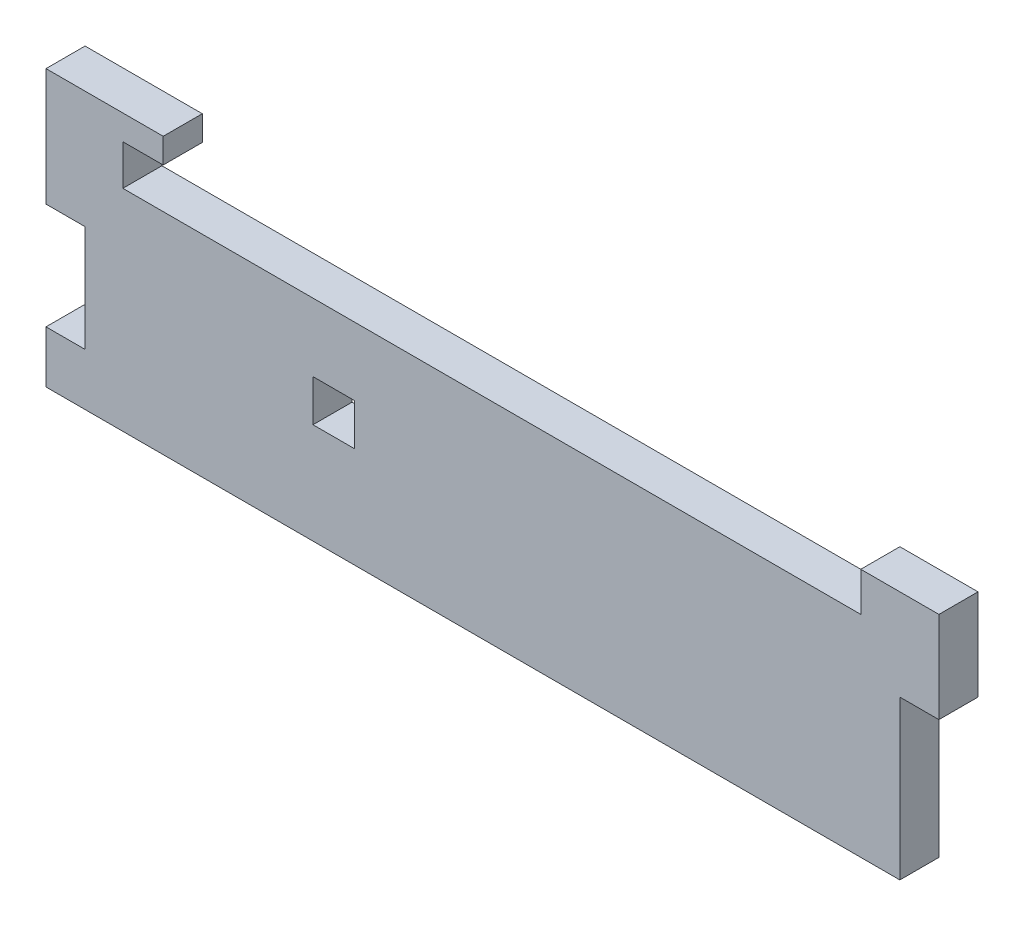
ISO-10303-21;
HEADER;
FILE_DESCRIPTION(('STEP AP214'),'2;1');
FILE_NAME('part.step','',(''),(''),'','','');
FILE_SCHEMA(('AUTOMOTIVE_DESIGN { 1 0 10303 214 1 1 1 1 }'));
ENDSEC;
DATA;
#1=APPLICATION_CONTEXT('core data for automotive mechanical design processes');
#2=APPLICATION_PROTOCOL_DEFINITION('international standard','automotive_design',2000,#1);
#3=PRODUCT_CONTEXT('',#1,'mechanical');
#4=PRODUCT('Part','Part','',(#3));
#5=PRODUCT_RELATED_PRODUCT_CATEGORY('part','',(#4));
#6=PRODUCT_DEFINITION_FORMATION('','',#4);
#7=PRODUCT_DEFINITION_CONTEXT('part definition',#1,'design');
#8=PRODUCT_DEFINITION('design','',#6,#7);
#9=PRODUCT_DEFINITION_SHAPE('','',#8);
#10=(LENGTH_UNIT() NAMED_UNIT(*) SI_UNIT(.MILLI.,.METRE.));
#11=(NAMED_UNIT(*) PLANE_ANGLE_UNIT() SI_UNIT($,.RADIAN.));
#12=(NAMED_UNIT(*) SI_UNIT($,.STERADIAN.) SOLID_ANGLE_UNIT());
#13=UNCERTAINTY_MEASURE_WITH_UNIT(LENGTH_MEASURE(1.E-05),#10,'distance_accuracy_value','');
#14=(GEOMETRIC_REPRESENTATION_CONTEXT(3) GLOBAL_UNCERTAINTY_ASSIGNED_CONTEXT((#13)) GLOBAL_UNIT_ASSIGNED_CONTEXT((#10,
#11,#12)) REPRESENTATION_CONTEXT('',''));
#15=CARTESIAN_POINT('',(0.,0.,0.));
#16=DIRECTION('',(0.,0.,1.));
#17=DIRECTION('',(1.,0.,0.));
#18=AXIS2_PLACEMENT_3D('',#15,#16,#17);
#19=CARTESIAN_POINT('',(-0.999999999999994,-3.,-14.1));
#20=DIRECTION('',(1.,0.,0.));
#21=DIRECTION('',(0.,1.,0.));
#22=AXIS2_PLACEMENT_3D('',#19,#20,#21);
#23=PLANE('',#22);
#24=DIRECTION('',(0.,0.,-1.));
#25=VECTOR('',#24,1.);
#26=CARTESIAN_POINT('',(-0.999999999999996,1.,-11.1));
#27=LINE('',#26,#25);
#28=CARTESIAN_POINT('',(-0.999999999999996,1.,-11.1));
#29=VERTEX_POINT('',#28);
#30=CARTESIAN_POINT('',(-0.999999999999996,1.,-14.1));
#31=VERTEX_POINT('',#30);
#32=EDGE_CURVE('E204',#29,#31,#27,.T.);
#33=ORIENTED_EDGE('',*,*,#32,.F.);
#34=DIRECTION('',(0.,1.,0.));
#35=VECTOR('',#34,1.);
#36=CARTESIAN_POINT('',(-0.999999999999994,-3.,-11.1));
#37=LINE('',#36,#35);
#38=CARTESIAN_POINT('',(-0.999999999999999,9.16000000000001,-11.1));
#39=VERTEX_POINT('',#38);
#40=EDGE_CURVE('E306',#29,#39,#37,.T.);
#41=ORIENTED_EDGE('',*,*,#40,.T.);
#42=DIRECTION('',(0.,0.,1.));
#43=VECTOR('',#42,1.);
#44=CARTESIAN_POINT('',(-0.999999999999999,9.16000000000001,-14.1));
#45=LINE('',#44,#43);
#46=CARTESIAN_POINT('',(-0.999999999999999,9.16000000000001,-14.1));
#47=VERTEX_POINT('',#46);
#48=EDGE_CURVE('E300',#47,#39,#45,.T.);
#49=ORIENTED_EDGE('',*,*,#48,.F.);
#50=DIRECTION('',(0.,1.,0.));
#51=VECTOR('',#50,1.);
#52=CARTESIAN_POINT('',(-0.999999999999994,-3.,-14.1));
#53=LINE('',#52,#51);
#54=EDGE_CURVE('E47',#31,#47,#53,.T.);
#55=ORIENTED_EDGE('',*,*,#54,.F.);
#56=EDGE_LOOP('',(#33,#41,#49,#55));
#57=FACE_BOUND('',#56,.T.);
#58=ADVANCED_FACE('F32',(#57),#23,.F.);
#59=CARTESIAN_POINT('',(61.56,13.16,-14.1));
#60=DIRECTION('',(0.,-1.,0.));
#61=DIRECTION('',(1.,0.,0.));
#62=AXIS2_PLACEMENT_3D('',#59,#60,#61);
#63=PLANE('',#62);
#64=DIRECTION('',(0.,0.,-1.));
#65=VECTOR('',#64,1.);
#66=CARTESIAN_POINT('',(58.56,13.16,-11.1));
#67=LINE('',#66,#65);
#68=CARTESIAN_POINT('',(58.56,13.16,-11.1));
#69=VERTEX_POINT('',#68);
#70=CARTESIAN_POINT('',(58.56,13.16,-14.1));
#71=VERTEX_POINT('',#70);
#72=EDGE_CURVE('E176',#69,#71,#67,.T.);
#73=ORIENTED_EDGE('',*,*,#72,.T.);
#74=DIRECTION('',(1.,0.,0.));
#75=VECTOR('',#74,1.);
#76=CARTESIAN_POINT('',(61.56,13.16,-14.1));
#77=LINE('',#76,#75);
#78=CARTESIAN_POINT('',(1.9,13.16,-14.1));
#79=VERTEX_POINT('',#78);
#80=EDGE_CURVE('E171',#79,#71,#77,.T.);
#81=ORIENTED_EDGE('',*,*,#80,.F.);
#82=DIRECTION('',(0.,0.,-1.));
#83=VECTOR('',#82,1.);
#84=CARTESIAN_POINT('',(1.9,13.16,24.14));
#85=LINE('',#84,#83);
#86=CARTESIAN_POINT('',(1.9,13.16,-11.1));
#87=VERTEX_POINT('',#86);
#88=EDGE_CURVE('E174',#87,#79,#85,.T.);
#89=ORIENTED_EDGE('',*,*,#88,.F.);
#90=DIRECTION('',(1.,0.,0.));
#91=VECTOR('',#90,1.);
#92=CARTESIAN_POINT('',(61.56,13.16,-11.1));
#93=LINE('',#92,#91);
#94=EDGE_CURVE('E303',#87,#69,#93,.T.);
#95=ORIENTED_EDGE('',*,*,#94,.T.);
#96=EDGE_LOOP('',(#73,#81,#89,#95));
#97=FACE_BOUND('',#96,.T.);
#98=ADVANCED_FACE('F173',(#97),#63,.F.);
#99=CARTESIAN_POINT('',(61.56,-3.,-14.1));
#100=DIRECTION('',(-1.,0.,0.));
#101=DIRECTION('',(0.,0.,1.));
#102=AXIS2_PLACEMENT_3D('',#99,#100,#101);
#103=PLANE('',#102);
#104=DIRECTION('',(0.,0.,-1.));
#105=VECTOR('',#104,1.);
#106=CARTESIAN_POINT('',(61.56,9.16000000000001,-11.1));
#107=LINE('',#106,#105);
#108=CARTESIAN_POINT('',(61.56,9.16000000000001,-11.1));
#109=VERTEX_POINT('',#108);
#110=CARTESIAN_POINT('',(61.56,9.16000000000001,-14.1));
#111=VERTEX_POINT('',#110);
#112=EDGE_CURVE('E273',#109,#111,#107,.T.);
#113=ORIENTED_EDGE('',*,*,#112,.F.);
#114=DIRECTION('',(0.,-1.,0.));
#115=VECTOR('',#114,1.);
#116=CARTESIAN_POINT('',(61.56,-3.,-11.1));
#117=LINE('',#116,#115);
#118=CARTESIAN_POINT('',(61.56,-3.,-11.1));
#119=VERTEX_POINT('',#118);
#120=EDGE_CURVE('E305',#109,#119,#117,.T.);
#121=ORIENTED_EDGE('',*,*,#120,.T.);
#122=DIRECTION('',(0.,0.,1.));
#123=VECTOR('',#122,1.);
#124=CARTESIAN_POINT('',(61.56,-3.,-14.1));
#125=LINE('',#124,#123);
#126=CARTESIAN_POINT('',(61.56,-3.,-14.1));
#127=VERTEX_POINT('',#126);
#128=EDGE_CURVE('E316',#127,#119,#125,.T.);
#129=ORIENTED_EDGE('',*,*,#128,.F.);
#130=DIRECTION('',(0.,-1.,0.));
#131=VECTOR('',#130,1.);
#132=CARTESIAN_POINT('',(61.56,-3.,-14.1));
#133=LINE('',#132,#131);
#134=EDGE_CURVE('E181',#111,#127,#133,.T.);
#135=ORIENTED_EDGE('',*,*,#134,.F.);
#136=EDGE_LOOP('',(#113,#121,#129,#135));
#137=FACE_BOUND('',#136,.T.);
#138=ADVANCED_FACE('F365',(#137),#103,.F.);
#139=CARTESIAN_POINT('',(61.56,-3.,-14.1));
#140=DIRECTION('',(0.,1.,0.));
#141=DIRECTION('',(0.,0.,1.));
#142=AXIS2_PLACEMENT_3D('',#139,#140,#141);
#143=PLANE('',#142);
#144=DIRECTION('',(-1.,0.,0.));
#145=VECTOR('',#144,1.);
#146=CARTESIAN_POINT('',(61.56,-3.,-11.1));
#147=LINE('',#146,#145);
#148=CARTESIAN_POINT('',(-3.99999999999999,-3.,-11.1));
#149=VERTEX_POINT('',#148);
#150=EDGE_CURVE('E325',#119,#149,#147,.T.);
#151=ORIENTED_EDGE('',*,*,#150,.T.);
#152=DIRECTION('',(0.,0.,1.));
#153=VECTOR('',#152,1.);
#154=CARTESIAN_POINT('',(-3.99999999999999,-3.,-14.1));
#155=LINE('',#154,#153);
#156=CARTESIAN_POINT('',(-3.99999999999999,-3.,-14.1));
#157=VERTEX_POINT('',#156);
#158=EDGE_CURVE('E214',#157,#149,#155,.T.);
#159=ORIENTED_EDGE('',*,*,#158,.F.);
#160=DIRECTION('',(-1.,0.,0.));
#161=VECTOR('',#160,1.);
#162=CARTESIAN_POINT('',(61.56,-3.,-14.1));
#163=LINE('',#162,#161);
#164=EDGE_CURVE('E319',#127,#157,#163,.T.);
#165=ORIENTED_EDGE('',*,*,#164,.F.);
#166=ORIENTED_EDGE('',*,*,#128,.T.);
#167=EDGE_LOOP('',(#151,#159,#165,#166));
#168=FACE_BOUND('',#167,.T.);
#169=ADVANCED_FACE('F34',(#168),#143,.F.);
#170=CARTESIAN_POINT('',(0.,0.,-14.1));
#171=DIRECTION('',(0.,0.,-1.));
#172=DIRECTION('',(-1.,0.,0.));
#173=AXIS2_PLACEMENT_3D('',#170,#171,#172);
#174=PLANE('',#173);
#175=DIRECTION('',(0.,1.,0.));
#176=VECTOR('',#175,1.);
#177=CARTESIAN_POINT('',(1.9,16.26,-14.1));
#178=LINE('',#177,#176);
#179=CARTESIAN_POINT('',(1.9,16.26,-14.1));
#180=VERTEX_POINT('',#179);
#181=EDGE_CURVE('E188',#79,#180,#178,.T.);
#182=ORIENTED_EDGE('',*,*,#181,.F.);
#183=ORIENTED_EDGE('',*,*,#80,.T.);
#184=DIRECTION('',(0.,1.,0.));
#185=VECTOR('',#184,1.);
#186=CARTESIAN_POINT('',(58.56,13.16,-14.1));
#187=LINE('',#186,#185);
#188=CARTESIAN_POINT('',(58.56,16.16,-14.1));
#189=VERTEX_POINT('',#188);
#190=EDGE_CURVE('E246',#71,#189,#187,.T.);
#191=ORIENTED_EDGE('',*,*,#190,.T.);
#192=DIRECTION('',(1.,0.,0.));
#193=VECTOR('',#192,1.);
#194=CARTESIAN_POINT('',(61.56,16.16,-14.1));
#195=LINE('',#194,#193);
#196=CARTESIAN_POINT('',(64.56,16.16,-14.1));
#197=VERTEX_POINT('',#196);
#198=EDGE_CURVE('E236',#189,#197,#195,.T.);
#199=ORIENTED_EDGE('',*,*,#198,.T.);
#200=DIRECTION('',(0.,1.,0.));
#201=VECTOR('',#200,1.);
#202=CARTESIAN_POINT('',(64.56,9.16000000000001,-14.1));
#203=LINE('',#202,#201);
#204=CARTESIAN_POINT('',(64.56,9.16000000000001,-14.1));
#205=VERTEX_POINT('',#204);
#206=EDGE_CURVE('E280',#205,#197,#203,.T.);
#207=ORIENTED_EDGE('',*,*,#206,.F.);
#208=DIRECTION('',(-1.,0.,0.));
#209=VECTOR('',#208,1.);
#210=CARTESIAN_POINT('',(64.56,9.16000000000001,-14.1));
#211=LINE('',#210,#209);
#212=EDGE_CURVE('E282',#205,#111,#211,.T.);
#213=ORIENTED_EDGE('',*,*,#212,.T.);
#214=ORIENTED_EDGE('',*,*,#134,.T.);
#215=ORIENTED_EDGE('',*,*,#164,.T.);
#216=DIRECTION('',(0.,-1.,0.));
#217=VECTOR('',#216,1.);
#218=CARTESIAN_POINT('',(-3.99999999999999,0.999999999999998,-14.1));
#219=LINE('',#218,#217);
#220=CARTESIAN_POINT('',(-3.99999999999999,0.999999999999998,-14.1));
#221=VERTEX_POINT('',#220);
#222=EDGE_CURVE('E217',#221,#157,#219,.T.);
#223=ORIENTED_EDGE('',*,*,#222,.F.);
#224=DIRECTION('',(1.,0.,0.));
#225=VECTOR('',#224,1.);
#226=CARTESIAN_POINT('',(-8.99999999999999,0.999999999999996,-14.1));
#227=LINE('',#226,#225);
#228=EDGE_CURVE('E207',#221,#31,#227,.T.);
#229=ORIENTED_EDGE('',*,*,#228,.T.);
#230=ORIENTED_EDGE('',*,*,#54,.T.);
#231=DIRECTION('',(1.,0.,0.));
#232=VECTOR('',#231,1.);
#233=CARTESIAN_POINT('',(-4.,9.16000000000001,-14.1));
#234=LINE('',#233,#232);
#235=CARTESIAN_POINT('',(-4.,9.16000000000001,-14.1));
#236=VERTEX_POINT('',#235);
#237=EDGE_CURVE('E322',#236,#47,#234,.T.);
#238=ORIENTED_EDGE('',*,*,#237,.F.);
#239=DIRECTION('',(0.,-1.,0.));
#240=VECTOR('',#239,1.);
#241=CARTESIAN_POINT('',(-4.,13.16,-14.1));
#242=LINE('',#241,#240);
#243=CARTESIAN_POINT('',(-4.,18.1718999125167,-14.1));
#244=VERTEX_POINT('',#243);
#245=EDGE_CURVE('E385',#244,#236,#242,.T.);
#246=ORIENTED_EDGE('',*,*,#245,.F.);
#247=DIRECTION('',(1.,0.,0.));
#248=VECTOR('',#247,1.);
#249=CARTESIAN_POINT('',(-4.,18.1718999125167,-14.1));
#250=LINE('',#249,#248);
#251=CARTESIAN_POINT('',(5.,18.1718999125167,-14.1));
#252=VERTEX_POINT('',#251);
#253=EDGE_CURVE('E256',#244,#252,#250,.T.);
#254=ORIENTED_EDGE('',*,*,#253,.T.);
#255=DIRECTION('',(0.,-1.,0.));
#256=VECTOR('',#255,1.);
#257=CARTESIAN_POINT('',(5.,18.1718999125167,-14.1));
#258=LINE('',#257,#256);
#259=CARTESIAN_POINT('',(5.,16.26,-14.1));
#260=VERTEX_POINT('',#259);
#261=EDGE_CURVE('E264',#252,#260,#258,.T.);
#262=ORIENTED_EDGE('',*,*,#261,.T.);
#263=DIRECTION('',(1.,0.,0.));
#264=VECTOR('',#263,1.);
#265=CARTESIAN_POINT('',(5.,16.26,-14.1));
#266=LINE('',#265,#264);
#267=EDGE_CURVE('E191',#180,#260,#266,.T.);
#268=ORIENTED_EDGE('',*,*,#267,.F.);
#269=EDGE_LOOP('',(#182,#183,#191,#199,#207,#213,#214,#215,#223,#229,#230,#238,#246,#254,#262,#268));
#270=FACE_BOUND('',#269,.T.);
#271=DIRECTION('',(0.,1.,0.));
#272=VECTOR('',#271,1.);
#273=CARTESIAN_POINT('',(16.5,7.94,-14.1));
#274=LINE('',#273,#272);
#275=CARTESIAN_POINT('',(16.5,4.74,-14.1));
#276=VERTEX_POINT('',#275);
#277=CARTESIAN_POINT('',(16.5,7.94,-14.1));
#278=VERTEX_POINT('',#277);
#279=EDGE_CURVE('E55',#276,#278,#274,.T.);
#280=ORIENTED_EDGE('',*,*,#279,.F.);
#281=DIRECTION('',(-1.,0.,0.));
#282=VECTOR('',#281,1.);
#283=CARTESIAN_POINT('',(19.7,4.74,-14.1));
#284=LINE('',#283,#282);
#285=CARTESIAN_POINT('',(19.7,4.74,-14.1));
#286=VERTEX_POINT('',#285);
#287=EDGE_CURVE('E230',#286,#276,#284,.T.);
#288=ORIENTED_EDGE('',*,*,#287,.F.);
#289=DIRECTION('',(0.,-1.,0.));
#290=VECTOR('',#289,1.);
#291=CARTESIAN_POINT('',(19.7,7.94,-14.1));
#292=LINE('',#291,#290);
#293=CARTESIAN_POINT('',(19.7,7.94,-14.1));
#294=VERTEX_POINT('',#293);
#295=EDGE_CURVE('E227',#294,#286,#292,.T.);
#296=ORIENTED_EDGE('',*,*,#295,.F.);
#297=DIRECTION('',(1.,0.,0.));
#298=VECTOR('',#297,1.);
#299=CARTESIAN_POINT('',(19.7,7.94,-14.1));
#300=LINE('',#299,#298);
#301=EDGE_CURVE('E224',#278,#294,#300,.T.);
#302=ORIENTED_EDGE('',*,*,#301,.F.);
#303=EDGE_LOOP('',(#280,#288,#296,#302));
#304=FACE_BOUND('',#303,.T.);
#305=ADVANCED_FACE('F193',(#270,#304),#174,.T.);
#306=CARTESIAN_POINT('',(0.,0.,-11.1));
#307=DIRECTION('',(0.,0.,-1.));
#308=DIRECTION('',(-1.,0.,0.));
#309=AXIS2_PLACEMENT_3D('',#306,#307,#308);
#310=PLANE('',#309);
#311=ORIENTED_EDGE('',*,*,#94,.F.);
#312=DIRECTION('',(0.,1.,0.));
#313=VECTOR('',#312,1.);
#314=CARTESIAN_POINT('',(1.9,0.,-11.1));
#315=LINE('',#314,#313);
#316=CARTESIAN_POINT('',(1.9,16.26,-11.1));
#317=VERTEX_POINT('',#316);
#318=EDGE_CURVE('E11',#87,#317,#315,.T.);
#319=ORIENTED_EDGE('',*,*,#318,.T.);
#320=DIRECTION('',(1.,0.,0.));
#321=VECTOR('',#320,1.);
#322=CARTESIAN_POINT('',(0.,16.26,-11.1));
#323=LINE('',#322,#321);
#324=CARTESIAN_POINT('',(5.,16.26,-11.1));
#325=VERTEX_POINT('',#324);
#326=EDGE_CURVE('E199',#317,#325,#323,.T.);
#327=ORIENTED_EDGE('',*,*,#326,.T.);
#328=DIRECTION('',(0.,-1.,0.));
#329=VECTOR('',#328,1.);
#330=CARTESIAN_POINT('',(5.,18.1718999125167,-11.1));
#331=LINE('',#330,#329);
#332=CARTESIAN_POINT('',(5.,18.1718999125167,-11.1));
#333=VERTEX_POINT('',#332);
#334=EDGE_CURVE('E263',#333,#325,#331,.T.);
#335=ORIENTED_EDGE('',*,*,#334,.F.);
#336=DIRECTION('',(1.,0.,0.));
#337=VECTOR('',#336,1.);
#338=CARTESIAN_POINT('',(-4.,18.1718999125167,-11.1));
#339=LINE('',#338,#337);
#340=CARTESIAN_POINT('',(-4.,18.1718999125167,-11.1));
#341=VERTEX_POINT('',#340);
#342=EDGE_CURVE('E260',#341,#333,#339,.T.);
#343=ORIENTED_EDGE('',*,*,#342,.F.);
#344=DIRECTION('',(0.,1.,0.));
#345=VECTOR('',#344,1.);
#346=CARTESIAN_POINT('',(-4.,9.16000000000001,-11.1));
#347=LINE('',#346,#345);
#348=CARTESIAN_POINT('',(-4.,9.16000000000001,-11.1));
#349=VERTEX_POINT('',#348);
#350=EDGE_CURVE('E285',#349,#341,#347,.T.);
#351=ORIENTED_EDGE('',*,*,#350,.F.);
#352=DIRECTION('',(1.,0.,0.));
#353=VECTOR('',#352,1.);
#354=CARTESIAN_POINT('',(-4.,9.16000000000001,-11.1));
#355=LINE('',#354,#353);
#356=EDGE_CURVE('E326',#349,#39,#355,.T.);
#357=ORIENTED_EDGE('',*,*,#356,.T.);
#358=ORIENTED_EDGE('',*,*,#40,.F.);
#359=DIRECTION('',(1.,0.,0.));
#360=VECTOR('',#359,1.);
#361=CARTESIAN_POINT('',(-8.99999999999999,0.999999999999996,-11.1));
#362=LINE('',#361,#360);
#363=CARTESIAN_POINT('',(-3.99999999999999,0.999999999999998,-11.1));
#364=VERTEX_POINT('',#363);
#365=EDGE_CURVE('E203',#364,#29,#362,.T.);
#366=ORIENTED_EDGE('',*,*,#365,.F.);
#367=DIRECTION('',(0.,1.,0.));
#368=VECTOR('',#367,1.);
#369=CARTESIAN_POINT('',(-3.99999999999999,-3.,-11.1));
#370=LINE('',#369,#368);
#371=EDGE_CURVE('E211',#149,#364,#370,.T.);
#372=ORIENTED_EDGE('',*,*,#371,.F.);
#373=ORIENTED_EDGE('',*,*,#150,.F.);
#374=ORIENTED_EDGE('',*,*,#120,.F.);
#375=DIRECTION('',(-1.,0.,0.));
#376=VECTOR('',#375,1.);
#377=CARTESIAN_POINT('',(64.56,9.16000000000001,-11.1));
#378=LINE('',#377,#376);
#379=CARTESIAN_POINT('',(64.56,9.16000000000001,-11.1));
#380=VERTEX_POINT('',#379);
#381=EDGE_CURVE('E295',#380,#109,#378,.T.);
#382=ORIENTED_EDGE('',*,*,#381,.F.);
#383=DIRECTION('',(0.,-1.,0.));
#384=VECTOR('',#383,1.);
#385=CARTESIAN_POINT('',(64.56,13.16,-11.1));
#386=LINE('',#385,#384);
#387=CARTESIAN_POINT('',(64.56,16.16,-11.1));
#388=VERTEX_POINT('',#387);
#389=EDGE_CURVE('E276',#388,#380,#386,.T.);
#390=ORIENTED_EDGE('',*,*,#389,.F.);
#391=DIRECTION('',(1.,0.,0.));
#392=VECTOR('',#391,1.);
#393=CARTESIAN_POINT('',(58.56,16.16,-11.1));
#394=LINE('',#393,#392);
#395=CARTESIAN_POINT('',(58.56,16.16,-11.1));
#396=VERTEX_POINT('',#395);
#397=EDGE_CURVE('E242',#396,#388,#394,.T.);
#398=ORIENTED_EDGE('',*,*,#397,.F.);
#399=DIRECTION('',(0.,1.,0.));
#400=VECTOR('',#399,1.);
#401=CARTESIAN_POINT('',(58.56,13.16,-11.1));
#402=LINE('',#401,#400);
#403=EDGE_CURVE('E245',#69,#396,#402,.T.);
#404=ORIENTED_EDGE('',*,*,#403,.F.);
#405=EDGE_LOOP('',(#311,#319,#327,#335,#343,#351,#357,#358,#366,#372,#373,#374,#382,#390,#398,#404));
#406=FACE_BOUND('',#405,.T.);
#407=DIRECTION('',(-1.,0.,0.));
#408=VECTOR('',#407,1.);
#409=CARTESIAN_POINT('',(0.,4.74,-11.1));
#410=LINE('',#409,#408);
#411=CARTESIAN_POINT('',(19.7,4.74,-11.1));
#412=VERTEX_POINT('',#411);
#413=CARTESIAN_POINT('',(16.5,4.74,-11.1));
#414=VERTEX_POINT('',#413);
#415=EDGE_CURVE('E346',#412,#414,#410,.T.);
#416=ORIENTED_EDGE('',*,*,#415,.T.);
#417=DIRECTION('',(0.,1.,0.));
#418=VECTOR('',#417,1.);
#419=CARTESIAN_POINT('',(16.5,0.,-11.1));
#420=LINE('',#419,#418);
#421=CARTESIAN_POINT('',(16.5,7.94,-11.1));
#422=VERTEX_POINT('',#421);
#423=EDGE_CURVE('E342',#414,#422,#420,.T.);
#424=ORIENTED_EDGE('',*,*,#423,.T.);
#425=DIRECTION('',(1.,0.,0.));
#426=VECTOR('',#425,1.);
#427=CARTESIAN_POINT('',(0.,7.94,-11.1));
#428=LINE('',#427,#426);
#429=CARTESIAN_POINT('',(19.7,7.94,-11.1));
#430=VERTEX_POINT('',#429);
#431=EDGE_CURVE('E354',#422,#430,#428,.T.);
#432=ORIENTED_EDGE('',*,*,#431,.T.);
#433=DIRECTION('',(0.,-1.,0.));
#434=VECTOR('',#433,1.);
#435=CARTESIAN_POINT('',(19.7,0.,-11.1));
#436=LINE('',#435,#434);
#437=EDGE_CURVE('E350',#430,#412,#436,.T.);
#438=ORIENTED_EDGE('',*,*,#437,.T.);
#439=EDGE_LOOP('',(#416,#424,#432,#438));
#440=FACE_BOUND('',#439,.T.);
#441=ADVANCED_FACE('F380',(#406,#440),#310,.F.);
#442=CARTESIAN_POINT('',(-4.,9.16000000000001,-14.1));
#443=DIRECTION('',(0.,1.,0.));
#444=DIRECTION('',(-1.,0.,0.));
#445=AXIS2_PLACEMENT_3D('',#442,#443,#444);
#446=PLANE('',#445);
#447=ORIENTED_EDGE('',*,*,#48,.T.);
#448=ORIENTED_EDGE('',*,*,#356,.F.);
#449=DIRECTION('',(0.,0.,1.));
#450=VECTOR('',#449,1.);
#451=CARTESIAN_POINT('',(-4.,9.16000000000001,-14.1));
#452=LINE('',#451,#450);
#453=EDGE_CURVE('E330',#236,#349,#452,.T.);
#454=ORIENTED_EDGE('',*,*,#453,.F.);
#455=ORIENTED_EDGE('',*,*,#237,.T.);
#456=EDGE_LOOP('',(#447,#448,#454,#455));
#457=FACE_BOUND('',#456,.T.);
#458=ADVANCED_FACE('F377',(#457),#446,.F.);
#459=CARTESIAN_POINT('',(-3.99999999999999,0.,0.));
#460=DIRECTION('',(-1.,0.,0.));
#461=DIRECTION('',(0.,-1.,0.));
#462=AXIS2_PLACEMENT_3D('',#459,#460,#461);
#463=PLANE('',#462);
#464=ORIENTED_EDGE('',*,*,#350,.T.);
#465=DIRECTION('',(0.,0.,-1.));
#466=VECTOR('',#465,1.);
#467=CARTESIAN_POINT('',(-4.,18.1718999125167,-11.1));
#468=LINE('',#467,#466);
#469=EDGE_CURVE('E267',#341,#244,#468,.T.);
#470=ORIENTED_EDGE('',*,*,#469,.T.);
#471=ORIENTED_EDGE('',*,*,#245,.T.);
#472=ORIENTED_EDGE('',*,*,#453,.T.);
#473=EDGE_LOOP('',(#464,#470,#471,#472));
#474=FACE_BOUND('',#473,.T.);
#475=ADVANCED_FACE('F386',(#474),#463,.T.);
#476=CARTESIAN_POINT('',(64.56,9.16000000000001,-11.1));
#477=DIRECTION('',(0.,1.,0.));
#478=DIRECTION('',(0.,0.,1.));
#479=AXIS2_PLACEMENT_3D('',#476,#477,#478);
#480=PLANE('',#479);
#481=ORIENTED_EDGE('',*,*,#112,.T.);
#482=ORIENTED_EDGE('',*,*,#212,.F.);
#483=DIRECTION('',(0.,0.,-1.));
#484=VECTOR('',#483,1.);
#485=CARTESIAN_POINT('',(64.56,9.16000000000001,-11.1));
#486=LINE('',#485,#484);
#487=EDGE_CURVE('E278',#380,#205,#486,.T.);
#488=ORIENTED_EDGE('',*,*,#487,.F.);
#489=ORIENTED_EDGE('',*,*,#381,.T.);
#490=EDGE_LOOP('',(#481,#482,#488,#489));
#491=FACE_BOUND('',#490,.T.);
#492=ADVANCED_FACE('F388',(#491),#480,.F.);
#493=CARTESIAN_POINT('',(64.56,0.,0.));
#494=DIRECTION('',(1.,0.,0.));
#495=DIRECTION('',(0.,0.,-1.));
#496=AXIS2_PLACEMENT_3D('',#493,#494,#495);
#497=PLANE('',#496);
#498=ORIENTED_EDGE('',*,*,#206,.T.);
#499=DIRECTION('',(0.,0.,-1.));
#500=VECTOR('',#499,1.);
#501=CARTESIAN_POINT('',(64.56,16.16,-11.1));
#502=LINE('',#501,#500);
#503=EDGE_CURVE('E249',#388,#197,#502,.T.);
#504=ORIENTED_EDGE('',*,*,#503,.F.);
#505=ORIENTED_EDGE('',*,*,#389,.T.);
#506=ORIENTED_EDGE('',*,*,#487,.T.);
#507=EDGE_LOOP('',(#498,#504,#505,#506));
#508=FACE_BOUND('',#507,.T.);
#509=ADVANCED_FACE('F394',(#508),#497,.T.);
#510=CARTESIAN_POINT('',(5.,18.1718999125167,-11.1));
#511=DIRECTION('',(1.,0.,0.));
#512=DIRECTION('',(0.,1.,0.));
#513=AXIS2_PLACEMENT_3D('',#510,#511,#512);
#514=PLANE('',#513);
#515=DIRECTION('',(0.,0.,1.));
#516=VECTOR('',#515,1.);
#517=CARTESIAN_POINT('',(5.,16.26,-11.1));
#518=LINE('',#517,#516);
#519=EDGE_CURVE('E40',#260,#325,#518,.T.);
#520=ORIENTED_EDGE('',*,*,#519,.F.);
#521=ORIENTED_EDGE('',*,*,#261,.F.);
#522=DIRECTION('',(0.,0.,-1.));
#523=VECTOR('',#522,1.);
#524=CARTESIAN_POINT('',(5.,18.1718999125167,-11.1));
#525=LINE('',#524,#523);
#526=EDGE_CURVE('E271',#333,#252,#525,.T.);
#527=ORIENTED_EDGE('',*,*,#526,.F.);
#528=ORIENTED_EDGE('',*,*,#334,.T.);
#529=EDGE_LOOP('',(#520,#521,#527,#528));
#530=FACE_BOUND('',#529,.T.);
#531=ADVANCED_FACE('F467',(#530),#514,.T.);
#532=CARTESIAN_POINT('',(-4.,18.1718999125167,-11.1));
#533=DIRECTION('',(0.,1.,0.));
#534=DIRECTION('',(0.,0.,1.));
#535=AXIS2_PLACEMENT_3D('',#532,#533,#534);
#536=PLANE('',#535);
#537=ORIENTED_EDGE('',*,*,#253,.F.);
#538=ORIENTED_EDGE('',*,*,#469,.F.);
#539=ORIENTED_EDGE('',*,*,#342,.T.);
#540=ORIENTED_EDGE('',*,*,#526,.T.);
#541=EDGE_LOOP('',(#537,#538,#539,#540));
#542=FACE_BOUND('',#541,.T.);
#543=ADVANCED_FACE('F481',(#542),#536,.T.);
#544=CARTESIAN_POINT('',(58.56,13.16,-11.1));
#545=DIRECTION('',(-1.,0.,0.));
#546=DIRECTION('',(0.,0.,1.));
#547=AXIS2_PLACEMENT_3D('',#544,#545,#546);
#548=PLANE('',#547);
#549=ORIENTED_EDGE('',*,*,#190,.F.);
#550=ORIENTED_EDGE('',*,*,#72,.F.);
#551=ORIENTED_EDGE('',*,*,#403,.T.);
#552=DIRECTION('',(0.,0.,-1.));
#553=VECTOR('',#552,1.);
#554=CARTESIAN_POINT('',(58.56,16.16,-11.1));
#555=LINE('',#554,#553);
#556=EDGE_CURVE('E253',#396,#189,#555,.T.);
#557=ORIENTED_EDGE('',*,*,#556,.T.);
#558=EDGE_LOOP('',(#549,#550,#551,#557));
#559=FACE_BOUND('',#558,.T.);
#560=ADVANCED_FACE('F491',(#559),#548,.T.);
#561=CARTESIAN_POINT('',(61.56,16.16,-11.1));
#562=DIRECTION('',(0.,1.,0.));
#563=DIRECTION('',(0.,0.,1.));
#564=AXIS2_PLACEMENT_3D('',#561,#562,#563);
#565=PLANE('',#564);
#566=ORIENTED_EDGE('',*,*,#198,.F.);
#567=ORIENTED_EDGE('',*,*,#556,.F.);
#568=ORIENTED_EDGE('',*,*,#397,.T.);
#569=ORIENTED_EDGE('',*,*,#503,.T.);
#570=EDGE_LOOP('',(#566,#567,#568,#569));
#571=FACE_BOUND('',#570,.T.);
#572=ADVANCED_FACE('F501',(#571),#565,.T.);
#573=CARTESIAN_POINT('',(16.5,7.94,24.14));
#574=DIRECTION('',(-1.,0.,0.));
#575=DIRECTION('',(0.,0.,1.));
#576=AXIS2_PLACEMENT_3D('',#573,#574,#575);
#577=PLANE('',#576);
#578=DIRECTION('',(0.,0.,-1.));
#579=VECTOR('',#578,1.);
#580=CARTESIAN_POINT('',(16.5,4.74,24.14));
#581=LINE('',#580,#579);
#582=EDGE_CURVE('E234',#414,#276,#581,.T.);
#583=ORIENTED_EDGE('',*,*,#582,.T.);
#584=ORIENTED_EDGE('',*,*,#279,.T.);
#585=DIRECTION('',(0.,0.,-1.));
#586=VECTOR('',#585,1.);
#587=CARTESIAN_POINT('',(16.5,7.94,24.14));
#588=LINE('',#587,#586);
#589=EDGE_CURVE('E233',#422,#278,#588,.T.);
#590=ORIENTED_EDGE('',*,*,#589,.F.);
#591=ORIENTED_EDGE('',*,*,#423,.F.);
#592=EDGE_LOOP('',(#583,#584,#590,#591));
#593=FACE_BOUND('',#592,.T.);
#594=ADVANCED_FACE('F511',(#593),#577,.F.);
#595=CARTESIAN_POINT('',(19.7,4.74,24.14));
#596=DIRECTION('',(0.,-1.,0.));
#597=DIRECTION('',(0.,0.,-1.));
#598=AXIS2_PLACEMENT_3D('',#595,#596,#597);
#599=PLANE('',#598);
#600=DIRECTION('',(0.,0.,-1.));
#601=VECTOR('',#600,1.);
#602=CARTESIAN_POINT('',(19.7,4.74,24.14));
#603=LINE('',#602,#601);
#604=EDGE_CURVE('E237',#412,#286,#603,.T.);
#605=ORIENTED_EDGE('',*,*,#604,.T.);
#606=ORIENTED_EDGE('',*,*,#287,.T.);
#607=ORIENTED_EDGE('',*,*,#582,.F.);
#608=ORIENTED_EDGE('',*,*,#415,.F.);
#609=EDGE_LOOP('',(#605,#606,#607,#608));
#610=FACE_BOUND('',#609,.T.);
#611=ADVANCED_FACE('F523',(#610),#599,.F.);
#612=CARTESIAN_POINT('',(19.7,7.94,24.14));
#613=DIRECTION('',(1.,0.,0.));
#614=DIRECTION('',(0.,0.,-1.));
#615=AXIS2_PLACEMENT_3D('',#612,#613,#614);
#616=PLANE('',#615);
#617=DIRECTION('',(0.,0.,-1.));
#618=VECTOR('',#617,1.);
#619=CARTESIAN_POINT('',(19.7,7.94,24.14));
#620=LINE('',#619,#618);
#621=EDGE_CURVE('E239',#430,#294,#620,.T.);
#622=ORIENTED_EDGE('',*,*,#621,.T.);
#623=ORIENTED_EDGE('',*,*,#295,.T.);
#624=ORIENTED_EDGE('',*,*,#604,.F.);
#625=ORIENTED_EDGE('',*,*,#437,.F.);
#626=EDGE_LOOP('',(#622,#623,#624,#625));
#627=FACE_BOUND('',#626,.T.);
#628=ADVANCED_FACE('F533',(#627),#616,.F.);
#629=CARTESIAN_POINT('',(19.7,7.94,24.14));
#630=DIRECTION('',(0.,1.,0.));
#631=DIRECTION('',(0.,0.,1.));
#632=AXIS2_PLACEMENT_3D('',#629,#630,#631);
#633=PLANE('',#632);
#634=ORIENTED_EDGE('',*,*,#589,.T.);
#635=ORIENTED_EDGE('',*,*,#301,.T.);
#636=ORIENTED_EDGE('',*,*,#621,.F.);
#637=ORIENTED_EDGE('',*,*,#431,.F.);
#638=EDGE_LOOP('',(#634,#635,#636,#637));
#639=FACE_BOUND('',#638,.T.);
#640=ADVANCED_FACE('F544',(#639),#633,.F.);
#641=CARTESIAN_POINT('',(-8.99999999999999,0.999999999999996,-11.1));
#642=DIRECTION('',(0.,-1.,0.));
#643=DIRECTION('',(1.,0.,0.));
#644=AXIS2_PLACEMENT_3D('',#641,#642,#643);
#645=PLANE('',#644);
#646=DIRECTION('',(0.,0.,-1.));
#647=VECTOR('',#646,1.);
#648=CARTESIAN_POINT('',(-3.99999999999999,0.999999999999998,-11.1));
#649=LINE('',#648,#647);
#650=EDGE_CURVE('E208',#364,#221,#649,.T.);
#651=ORIENTED_EDGE('',*,*,#650,.F.);
#652=ORIENTED_EDGE('',*,*,#365,.T.);
#653=ORIENTED_EDGE('',*,*,#32,.T.);
#654=ORIENTED_EDGE('',*,*,#228,.F.);
#655=EDGE_LOOP('',(#651,#652,#653,#654));
#656=FACE_BOUND('',#655,.T.);
#657=ADVANCED_FACE('F372',(#656),#645,.F.);
#658=CARTESIAN_POINT('',(-3.99999999999999,0.,0.));
#659=DIRECTION('',(-1.,0.,0.));
#660=DIRECTION('',(0.,-1.,0.));
#661=AXIS2_PLACEMENT_3D('',#658,#659,#660);
#662=PLANE('',#661);
#663=ORIENTED_EDGE('',*,*,#222,.T.);
#664=ORIENTED_EDGE('',*,*,#158,.T.);
#665=ORIENTED_EDGE('',*,*,#371,.T.);
#666=ORIENTED_EDGE('',*,*,#650,.T.);
#667=EDGE_LOOP('',(#663,#664,#665,#666));
#668=FACE_BOUND('',#667,.T.);
#669=ADVANCED_FACE('F369',(#668),#662,.T.);
#670=CARTESIAN_POINT('',(1.9,16.26,24.14));
#671=DIRECTION('',(-1.,0.,0.));
#672=DIRECTION('',(0.,0.,1.));
#673=AXIS2_PLACEMENT_3D('',#670,#671,#672);
#674=PLANE('',#673);
#675=ORIENTED_EDGE('',*,*,#88,.T.);
#676=ORIENTED_EDGE('',*,*,#181,.T.);
#677=DIRECTION('',(0.,0.,-1.));
#678=VECTOR('',#677,1.);
#679=CARTESIAN_POINT('',(1.9,16.26,24.14));
#680=LINE('',#679,#678);
#681=EDGE_CURVE('E190',#317,#180,#680,.T.);
#682=ORIENTED_EDGE('',*,*,#681,.F.);
#683=ORIENTED_EDGE('',*,*,#318,.F.);
#684=EDGE_LOOP('',(#675,#676,#682,#683));
#685=FACE_BOUND('',#684,.T.);
#686=ADVANCED_FACE('F186',(#685),#674,.F.);
#687=CARTESIAN_POINT('',(5.,16.26,24.14));
#688=DIRECTION('',(0.,1.,0.));
#689=DIRECTION('',(-1.,0.,0.));
#690=AXIS2_PLACEMENT_3D('',#687,#688,#689);
#691=PLANE('',#690);
#692=ORIENTED_EDGE('',*,*,#681,.T.);
#693=ORIENTED_EDGE('',*,*,#267,.T.);
#694=ORIENTED_EDGE('',*,*,#519,.T.);
#695=ORIENTED_EDGE('',*,*,#326,.F.);
#696=EDGE_LOOP('',(#692,#693,#694,#695));
#697=FACE_BOUND('',#696,.T.);
#698=ADVANCED_FACE('F579',(#697),#691,.F.);
#699=CLOSED_SHELL('',(#58,#98,#138,#169,#305,#441,#458,#475,#492,#509,#531,#543,#560,#572,#594,
#611,#628,#640,#657,#669,#686,#698));
#700=MANIFOLD_SOLID_BREP('B2',#699);
#701=ADVANCED_BREP_SHAPE_REPRESENTATION('',(#18,#700),#14);
#702=SHAPE_DEFINITION_REPRESENTATION(#9,#701);
ENDSEC;
END-ISO-10303-21;
